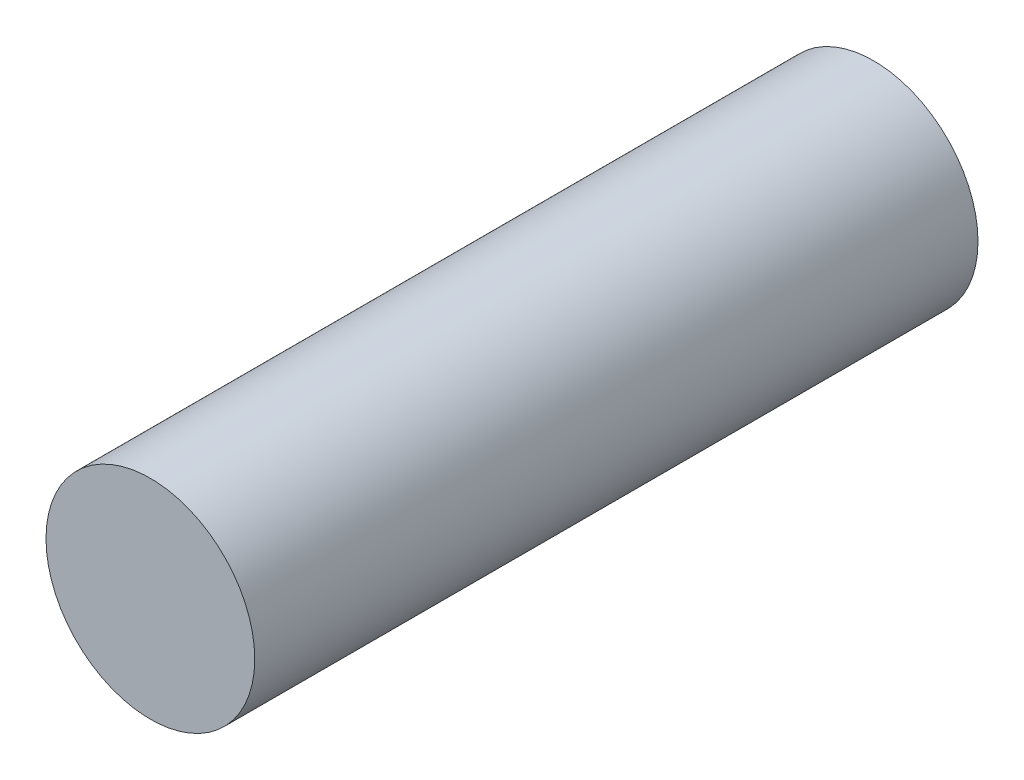
ISO-10303-21;
HEADER;
FILE_DESCRIPTION(('STEP AP214'),'2;1');
FILE_NAME('part.step','',(''),(''),'','','');
FILE_SCHEMA(('AUTOMOTIVE_DESIGN { 1 0 10303 214 1 1 1 1 }'));
ENDSEC;
DATA;
#1=APPLICATION_CONTEXT('core data for automotive mechanical design processes');
#2=APPLICATION_PROTOCOL_DEFINITION('international standard','automotive_design',2000,#1);
#3=PRODUCT_CONTEXT('',#1,'mechanical');
#4=PRODUCT('Part','Part','',(#3));
#5=PRODUCT_RELATED_PRODUCT_CATEGORY('part','',(#4));
#6=PRODUCT_DEFINITION_FORMATION('','',#4);
#7=PRODUCT_DEFINITION_CONTEXT('part definition',#1,'design');
#8=PRODUCT_DEFINITION('design','',#6,#7);
#9=PRODUCT_DEFINITION_SHAPE('','',#8);
#10=(LENGTH_UNIT() NAMED_UNIT(*) SI_UNIT(.MILLI.,.METRE.));
#11=(NAMED_UNIT(*) PLANE_ANGLE_UNIT() SI_UNIT($,.RADIAN.));
#12=(NAMED_UNIT(*) SI_UNIT($,.STERADIAN.) SOLID_ANGLE_UNIT());
#13=UNCERTAINTY_MEASURE_WITH_UNIT(LENGTH_MEASURE(1.E-05),#10,'distance_accuracy_value','');
#14=(GEOMETRIC_REPRESENTATION_CONTEXT(3) GLOBAL_UNCERTAINTY_ASSIGNED_CONTEXT((#13)) GLOBAL_UNIT_ASSIGNED_CONTEXT((#10,
#11,#12)) REPRESENTATION_CONTEXT('',''));
#15=CARTESIAN_POINT('',(0.,0.,0.));
#16=DIRECTION('',(0.,0.,1.));
#17=DIRECTION('',(1.,0.,0.));
#18=AXIS2_PLACEMENT_3D('',#15,#16,#17);
#19=CARTESIAN_POINT('',(0.,0.,44.));
#20=DIRECTION('',(0.,0.,-1.));
#21=DIRECTION('',(-1.,0.,0.));
#22=AXIS2_PLACEMENT_3D('',#19,#20,#21);
#23=CYLINDRICAL_SURFACE('',#22,6.35);
#24=CARTESIAN_POINT('',(0.,0.,44.));
#25=DIRECTION('',(0.,0.,1.));
#26=DIRECTION('',(1.,0.,0.));
#27=AXIS2_PLACEMENT_3D('',#24,#25,#26);
#28=CIRCLE('',#27,6.35);
#29=CARTESIAN_POINT('',(6.35,0.,44.));
#30=VERTEX_POINT('',#29);
#31=EDGE_CURVE('E10',#30,#30,#28,.T.);
#32=ORIENTED_EDGE('',*,*,#31,.F.);
#33=EDGE_LOOP('',(#32));
#34=FACE_BOUND('',#33,.T.);
#35=CARTESIAN_POINT('',(0.,0.,0.));
#36=DIRECTION('',(0.,0.,1.));
#37=DIRECTION('',(1.,0.,0.));
#38=AXIS2_PLACEMENT_3D('',#35,#36,#37);
#39=CIRCLE('',#38,6.35);
#40=CARTESIAN_POINT('',(6.35,0.,0.));
#41=VERTEX_POINT('',#40);
#42=EDGE_CURVE('E33',#41,#41,#39,.T.);
#43=ORIENTED_EDGE('',*,*,#42,.T.);
#44=EDGE_LOOP('',(#43));
#45=FACE_BOUND('',#44,.T.);
#46=ADVANCED_FACE('F30',(#34,#45),#23,.T.);
#47=CARTESIAN_POINT('',(0.,0.,44.));
#48=DIRECTION('',(0.,0.,1.));
#49=DIRECTION('',(1.,0.,0.));
#50=AXIS2_PLACEMENT_3D('',#47,#48,#49);
#51=PLANE('',#50);
#52=ORIENTED_EDGE('',*,*,#31,.T.);
#53=EDGE_LOOP('',(#52));
#54=FACE_BOUND('',#53,.T.);
#55=ADVANCED_FACE('F45',(#54),#51,.T.);
#56=CARTESIAN_POINT('',(0.,0.,0.));
#57=DIRECTION('',(0.,0.,1.));
#58=DIRECTION('',(1.,0.,0.));
#59=AXIS2_PLACEMENT_3D('',#56,#57,#58);
#60=PLANE('',#59);
#61=ORIENTED_EDGE('',*,*,#42,.F.);
#62=EDGE_LOOP('',(#61));
#63=FACE_BOUND('',#62,.T.);
#64=ADVANCED_FACE('F43',(#63),#60,.F.);
#65=CLOSED_SHELL('',(#46,#55,#64));
#66=MANIFOLD_SOLID_BREP('B2',#65);
#67=ADVANCED_BREP_SHAPE_REPRESENTATION('',(#18,#66),#14);
#68=SHAPE_DEFINITION_REPRESENTATION(#9,#67);
ENDSEC;
END-ISO-10303-21;
